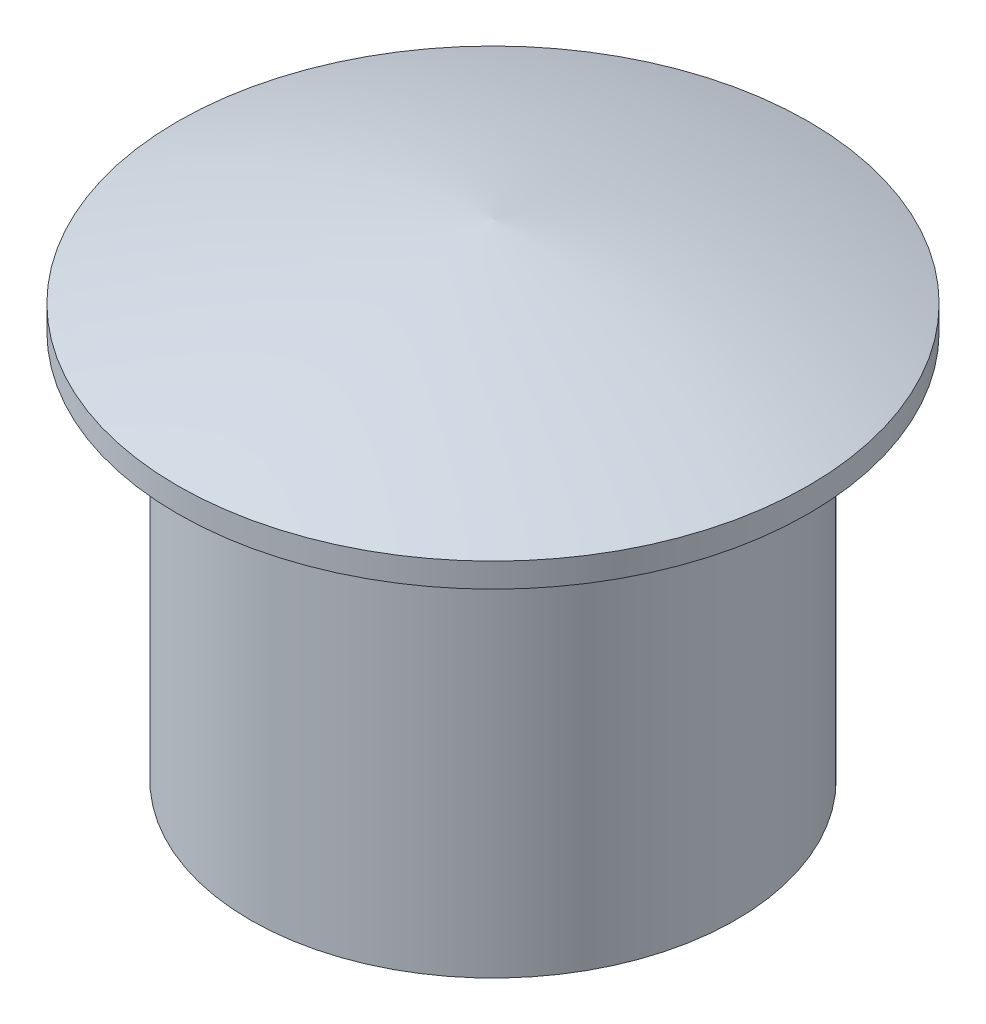
ISO-10303-21;
HEADER;
FILE_DESCRIPTION(('STEP AP214'),'2;1');
FILE_NAME('part.step','',(''),(''),'','','');
FILE_SCHEMA(('AUTOMOTIVE_DESIGN { 1 0 10303 214 1 1 1 1 }'));
ENDSEC;
DATA;
#1=APPLICATION_CONTEXT('core data for automotive mechanical design processes');
#2=APPLICATION_PROTOCOL_DEFINITION('international standard','automotive_design',2000,#1);
#3=PRODUCT_CONTEXT('',#1,'mechanical');
#4=PRODUCT('Part','Part','',(#3));
#5=PRODUCT_RELATED_PRODUCT_CATEGORY('part','',(#4));
#6=PRODUCT_DEFINITION_FORMATION('','',#4);
#7=PRODUCT_DEFINITION_CONTEXT('part definition',#1,'design');
#8=PRODUCT_DEFINITION('design','',#6,#7);
#9=PRODUCT_DEFINITION_SHAPE('','',#8);
#10=(LENGTH_UNIT() NAMED_UNIT(*) SI_UNIT(.MILLI.,.METRE.));
#11=(NAMED_UNIT(*) PLANE_ANGLE_UNIT() SI_UNIT($,.RADIAN.));
#12=(NAMED_UNIT(*) SI_UNIT($,.STERADIAN.) SOLID_ANGLE_UNIT());
#13=UNCERTAINTY_MEASURE_WITH_UNIT(LENGTH_MEASURE(1.E-05),#10,'distance_accuracy_value','');
#14=(GEOMETRIC_REPRESENTATION_CONTEXT(3) GLOBAL_UNCERTAINTY_ASSIGNED_CONTEXT((#13)) GLOBAL_UNIT_ASSIGNED_CONTEXT((#10,
#11,#12)) REPRESENTATION_CONTEXT('',''));
#15=CARTESIAN_POINT('',(0.,0.,0.));
#16=DIRECTION('',(0.,0.,1.));
#17=DIRECTION('',(1.,0.,0.));
#18=AXIS2_PLACEMENT_3D('',#15,#16,#17);
#19=CARTESIAN_POINT('',(-10.,-4.00000000000001,0.));
#20=DIRECTION('',(0.,-1.,0.));
#21=DIRECTION('',(0.,0.,-1.));
#22=AXIS2_PLACEMENT_3D('',#19,#20,#21);
#23=PLANE('',#22);
#24=CARTESIAN_POINT('',(0.,-4.00000000000001,0.));
#25=DIRECTION('',(0.,1.,0.));
#26=DIRECTION('',(0.,0.,1.));
#27=AXIS2_PLACEMENT_3D('',#24,#25,#26);
#28=CIRCLE('',#27,10.);
#29=CARTESIAN_POINT('',(0.,-4.00000000000001,10.));
#30=VERTEX_POINT('',#29);
#31=EDGE_CURVE('E69',#30,#30,#28,.T.);
#32=ORIENTED_EDGE('',*,*,#31,.T.);
#33=EDGE_LOOP('',(#32));
#34=FACE_BOUND('',#33,.T.);
#35=CARTESIAN_POINT('',(0.,-4.00000000000001,0.));
#36=DIRECTION('',(0.,1.,0.));
#37=DIRECTION('',(0.,0.,1.));
#38=AXIS2_PLACEMENT_3D('',#35,#36,#37);
#39=CIRCLE('',#38,13.);
#40=CARTESIAN_POINT('',(0.,-4.00000000000001,13.));
#41=VERTEX_POINT('',#40);
#42=EDGE_CURVE('E11',#41,#41,#39,.T.);
#43=ORIENTED_EDGE('',*,*,#42,.F.);
#44=EDGE_LOOP('',(#43));
#45=FACE_BOUND('',#44,.T.);
#46=ADVANCED_FACE('F38',(#34,#45),#23,.T.);
#47=CARTESIAN_POINT('',(0.,20.1324503311258,0.));
#48=DIRECTION('',(0.,1.,0.));
#49=DIRECTION('',(0.,0.,1.));
#50=AXIS2_PLACEMENT_3D('',#47,#48,#49);
#51=CYLINDRICAL_SURFACE('',#50,13.);
#52=ORIENTED_EDGE('',*,*,#42,.T.);
#53=EDGE_LOOP('',(#52));
#54=FACE_BOUND('',#53,.T.);
#55=CARTESIAN_POINT('',(0.,-3.00000000000001,0.));
#56=DIRECTION('',(0.,1.,0.));
#57=DIRECTION('',(0.,0.,1.));
#58=AXIS2_PLACEMENT_3D('',#55,#56,#57);
#59=CIRCLE('',#58,13.);
#60=CARTESIAN_POINT('',(0.,-3.00000000000001,13.));
#61=VERTEX_POINT('',#60);
#62=EDGE_CURVE('E44',#61,#61,#59,.T.);
#63=ORIENTED_EDGE('',*,*,#62,.F.);
#64=EDGE_LOOP('',(#63));
#65=FACE_BOUND('',#64,.T.);
#66=ADVANCED_FACE('F50',(#54,#65),#51,.T.);
#67=CARTESIAN_POINT('',(0.,-56.3750039062398,-6.16346243990148));
#68=DIRECTION('',(-1.,0.,0.));
#69=DIRECTION('',(0.,0.,1.));
#70=AXIS2_PLACEMENT_3D('',#67,#68,#69);
#71=CIRCLE('',#70,56.710927824156);
#72=TRIMMED_CURVE('',#71,(PARAMETER_VALUE(-1.46189913143812)),
(PARAMETER_VALUE(1.46189913143812)),.T.,.PARAMETER.);
#73=CARTESIAN_POINT('',(0.,-56.3750039062398,0.));
#74=DIRECTION('',(0.,1.,0.));
#75=AXIS1_PLACEMENT('',#73,#74);
#76=SURFACE_OF_REVOLUTION('',#72,#75);
#77=ORIENTED_EDGE('',*,*,#62,.T.);
#78=EDGE_LOOP('',(#77));
#79=FACE_BOUND('',#78,.T.);
#80=CARTESIAN_POINT('',(0.,0.,0.));
#81=VERTEX_POINT('',#80);
#82=VERTEX_LOOP('',#81);
#83=FACE_BOUND('',#82,.T.);
#84=ADVANCED_FACE('F47',(#79,#83),#76,.T.);
#85=CARTESIAN_POINT('',(-10.,-20.,0.));
#86=DIRECTION('',(0.,-1.,0.));
#87=DIRECTION('',(0.,0.,-1.));
#88=AXIS2_PLACEMENT_3D('',#85,#86,#87);
#89=PLANE('',#88);
#90=CARTESIAN_POINT('',(0.,-20.,0.));
#91=DIRECTION('',(0.,1.,0.));
#92=DIRECTION('',(0.,0.,1.));
#93=AXIS2_PLACEMENT_3D('',#90,#91,#92);
#94=CIRCLE('',#93,10.);
#95=CARTESIAN_POINT('',(0.,-20.,10.));
#96=VERTEX_POINT('',#95);
#97=EDGE_CURVE('E73',#96,#96,#94,.T.);
#98=ORIENTED_EDGE('',*,*,#97,.F.);
#99=EDGE_LOOP('',(#98));
#100=FACE_BOUND('',#99,.T.);
#101=ADVANCED_FACE('F49',(#100),#89,.T.);
#102=CARTESIAN_POINT('',(0.,20.1324503311258,0.));
#103=DIRECTION('',(0.,1.,0.));
#104=DIRECTION('',(0.,0.,1.));
#105=AXIS2_PLACEMENT_3D('',#102,#103,#104);
#106=CYLINDRICAL_SURFACE('',#105,10.);
#107=ORIENTED_EDGE('',*,*,#97,.T.);
#108=EDGE_LOOP('',(#107));
#109=FACE_BOUND('',#108,.T.);
#110=ORIENTED_EDGE('',*,*,#31,.F.);
#111=EDGE_LOOP('',(#110));
#112=FACE_BOUND('',#111,.T.);
#113=ADVANCED_FACE('F57',(#109,#112),#106,.T.);
#114=CLOSED_SHELL('',(#46,#66,#84,#101,#113));
#115=MANIFOLD_SOLID_BREP('B2',#114);
#116=ADVANCED_BREP_SHAPE_REPRESENTATION('',(#18,#115),#14);
#117=SHAPE_DEFINITION_REPRESENTATION(#9,#116);
ENDSEC;
END-ISO-10303-21;
